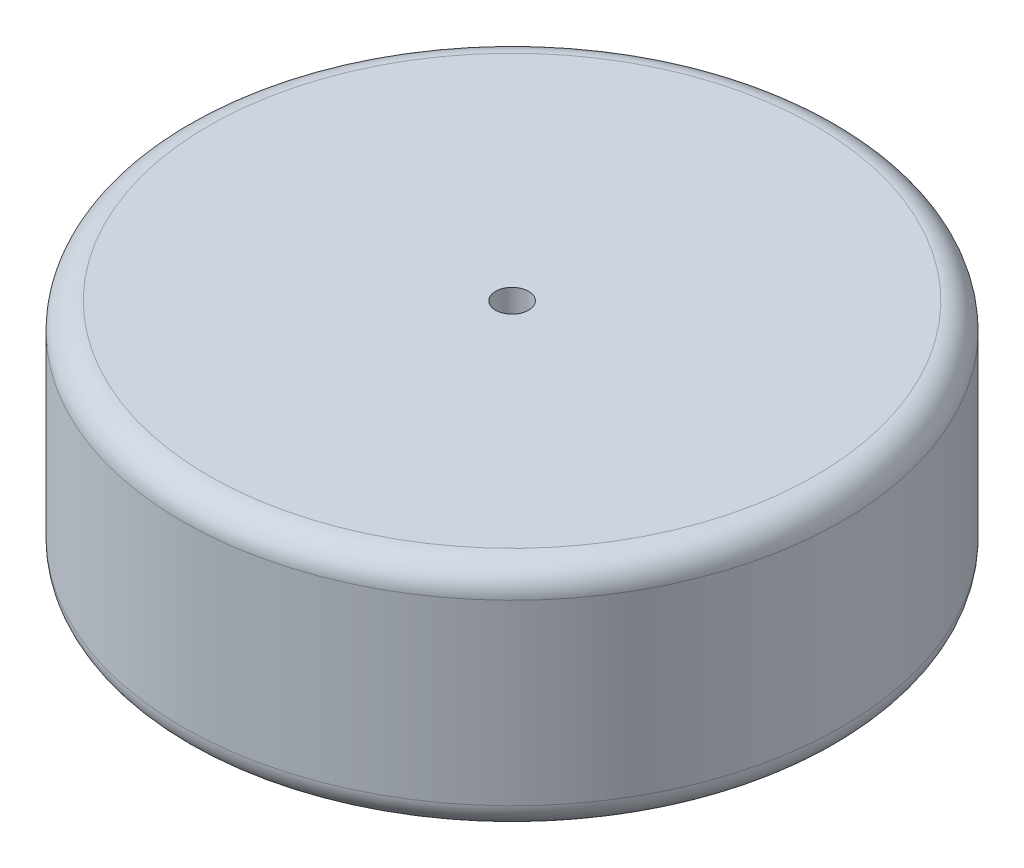
ISO-10303-21;
HEADER;
FILE_DESCRIPTION(('STEP AP214'),'2;1');
FILE_NAME('part.step','',(''),(''),'','','');
FILE_SCHEMA(('AUTOMOTIVE_DESIGN { 1 0 10303 214 1 1 1 1 }'));
ENDSEC;
DATA;
#1=APPLICATION_CONTEXT('core data for automotive mechanical design processes');
#2=APPLICATION_PROTOCOL_DEFINITION('international standard','automotive_design',2000,#1);
#3=PRODUCT_CONTEXT('',#1,'mechanical');
#4=PRODUCT('Part','Part','',(#3));
#5=PRODUCT_RELATED_PRODUCT_CATEGORY('part','',(#4));
#6=PRODUCT_DEFINITION_FORMATION('','',#4);
#7=PRODUCT_DEFINITION_CONTEXT('part definition',#1,'design');
#8=PRODUCT_DEFINITION('design','',#6,#7);
#9=PRODUCT_DEFINITION_SHAPE('','',#8);
#10=(LENGTH_UNIT() NAMED_UNIT(*) SI_UNIT(.MILLI.,.METRE.));
#11=(NAMED_UNIT(*) PLANE_ANGLE_UNIT() SI_UNIT($,.RADIAN.));
#12=(NAMED_UNIT(*) SI_UNIT($,.STERADIAN.) SOLID_ANGLE_UNIT());
#13=UNCERTAINTY_MEASURE_WITH_UNIT(LENGTH_MEASURE(1.E-05),#10,'distance_accuracy_value','');
#14=(GEOMETRIC_REPRESENTATION_CONTEXT(3) GLOBAL_UNCERTAINTY_ASSIGNED_CONTEXT((#13)) GLOBAL_UNIT_ASSIGNED_CONTEXT((#10,
#11,#12)) REPRESENTATION_CONTEXT('',''));
#15=CARTESIAN_POINT('',(0.,0.,0.));
#16=DIRECTION('',(0.,0.,1.));
#17=DIRECTION('',(1.,0.,0.));
#18=AXIS2_PLACEMENT_3D('',#15,#16,#17);
#19=CARTESIAN_POINT('',(0.,70.,0.));
#20=DIRECTION('',(0.,-1.,0.));
#21=DIRECTION('',(0.,0.,-1.));
#22=AXIS2_PLACEMENT_3D('',#19,#20,#21);
#23=CYLINDRICAL_SURFACE('',#22,100.);
#24=CARTESIAN_POINT('',(0.,8.,0.));
#25=DIRECTION('',(0.,1.,0.));
#26=DIRECTION('',(0.,0.,1.));
#27=AXIS2_PLACEMENT_3D('',#24,#25,#26);
#28=CIRCLE('',#27,100.);
#29=CARTESIAN_POINT('',(0.,8.,100.));
#30=VERTEX_POINT('',#29);
#31=EDGE_CURVE('E48',#30,#30,#28,.T.);
#32=ORIENTED_EDGE('',*,*,#31,.T.);
#33=EDGE_LOOP('',(#32));
#34=FACE_BOUND('',#33,.T.);
#35=CARTESIAN_POINT('',(0.,62.,0.));
#36=DIRECTION('',(0.,1.,0.));
#37=DIRECTION('',(0.,0.,1.));
#38=AXIS2_PLACEMENT_3D('',#35,#36,#37);
#39=CIRCLE('',#38,100.);
#40=CARTESIAN_POINT('',(0.,62.,100.));
#41=VERTEX_POINT('',#40);
#42=EDGE_CURVE('E52',#41,#41,#39,.F.);
#43=ORIENTED_EDGE('',*,*,#42,.T.);
#44=EDGE_LOOP('',(#43));
#45=FACE_BOUND('',#44,.T.);
#46=ADVANCED_FACE('F37',(#34,#45),#23,.T.);
#47=CARTESIAN_POINT('',(0.,70.,0.));
#48=DIRECTION('',(0.,1.,0.));
#49=DIRECTION('',(0.,0.,1.));
#50=AXIS2_PLACEMENT_3D('',#47,#48,#49);
#51=PLANE('',#50);
#52=CARTESIAN_POINT('',(0.,70.,0.));
#53=DIRECTION('',(0.,-1.,0.));
#54=DIRECTION('',(0.,0.,-1.));
#55=AXIS2_PLACEMENT_3D('',#52,#53,#54);
#56=CIRCLE('',#55,5.);
#57=CARTESIAN_POINT('',(0.,70.,-5.));
#58=VERTEX_POINT('',#57);
#59=EDGE_CURVE('E57',#58,#58,#56,.T.);
#60=ORIENTED_EDGE('',*,*,#59,.T.);
#61=EDGE_LOOP('',(#60));
#62=FACE_BOUND('',#61,.T.);
#63=CARTESIAN_POINT('',(0.,70.,0.));
#64=DIRECTION('',(0.,1.,0.));
#65=DIRECTION('',(0.,0.,1.));
#66=AXIS2_PLACEMENT_3D('',#63,#64,#65);
#67=CIRCLE('',#66,92.);
#68=CARTESIAN_POINT('',(0.,70.,92.));
#69=VERTEX_POINT('',#68);
#70=EDGE_CURVE('E10',#69,#69,#67,.T.);
#71=ORIENTED_EDGE('',*,*,#70,.T.);
#72=EDGE_LOOP('',(#71));
#73=FACE_BOUND('',#72,.T.);
#74=ADVANCED_FACE('F64',(#62,#73),#51,.T.);
#75=CARTESIAN_POINT('',(0.,0.,0.));
#76=DIRECTION('',(0.,1.,0.));
#77=DIRECTION('',(0.,0.,1.));
#78=AXIS2_PLACEMENT_3D('',#75,#76,#77);
#79=PLANE('',#78);
#80=CARTESIAN_POINT('',(0.,0.,0.));
#81=DIRECTION('',(0.,-1.,0.));
#82=DIRECTION('',(0.,0.,-1.));
#83=AXIS2_PLACEMENT_3D('',#80,#81,#82);
#84=CIRCLE('',#83,5.);
#85=CARTESIAN_POINT('',(0.,0.,-5.));
#86=VERTEX_POINT('',#85);
#87=EDGE_CURVE('E58',#86,#86,#84,.T.);
#88=ORIENTED_EDGE('',*,*,#87,.F.);
#89=EDGE_LOOP('',(#88));
#90=FACE_BOUND('',#89,.T.);
#91=CARTESIAN_POINT('',(0.,0.,0.));
#92=DIRECTION('',(0.,1.,0.));
#93=DIRECTION('',(0.,0.,1.));
#94=AXIS2_PLACEMENT_3D('',#91,#92,#93);
#95=CIRCLE('',#94,92.);
#96=CARTESIAN_POINT('',(0.,0.,92.));
#97=VERTEX_POINT('',#96);
#98=EDGE_CURVE('E44',#97,#97,#95,.F.);
#99=ORIENTED_EDGE('',*,*,#98,.T.);
#100=EDGE_LOOP('',(#99));
#101=FACE_BOUND('',#100,.T.);
#102=ADVANCED_FACE('F72',(#90,#101),#79,.F.);
#103=CARTESIAN_POINT('',(0.,8.,0.));
#104=DIRECTION('',(0.,1.,0.));
#105=DIRECTION('',(0.,0.,1.));
#106=AXIS2_PLACEMENT_3D('',#103,#104,#105);
#107=TOROIDAL_SURFACE('',#106,92.,8.);
#108=ORIENTED_EDGE('',*,*,#98,.F.);
#109=EDGE_LOOP('',(#108));
#110=FACE_BOUND('',#109,.T.);
#111=ORIENTED_EDGE('',*,*,#31,.F.);
#112=EDGE_LOOP('',(#111));
#113=FACE_BOUND('',#112,.T.);
#114=ADVANCED_FACE('F74',(#110,#113),#107,.T.);
#115=CARTESIAN_POINT('',(0.,62.,0.));
#116=DIRECTION('',(0.,1.,0.));
#117=DIRECTION('',(0.,0.,1.));
#118=AXIS2_PLACEMENT_3D('',#115,#116,#117);
#119=TOROIDAL_SURFACE('',#118,92.,8.);
#120=ORIENTED_EDGE('',*,*,#42,.F.);
#121=EDGE_LOOP('',(#120));
#122=FACE_BOUND('',#121,.T.);
#123=ORIENTED_EDGE('',*,*,#70,.F.);
#124=EDGE_LOOP('',(#123));
#125=FACE_BOUND('',#124,.T.);
#126=ADVANCED_FACE('F39',(#122,#125),#119,.T.);
#127=CARTESIAN_POINT('',(0.,70.,0.));
#128=DIRECTION('',(0.,-1.,0.));
#129=DIRECTION('',(0.,0.,-1.));
#130=AXIS2_PLACEMENT_3D('',#127,#128,#129);
#131=CYLINDRICAL_SURFACE('',#130,5.);
#132=ORIENTED_EDGE('',*,*,#59,.F.);
#133=EDGE_LOOP('',(#132));
#134=FACE_BOUND('',#133,.T.);
#135=ORIENTED_EDGE('',*,*,#87,.T.);
#136=EDGE_LOOP('',(#135));
#137=FACE_BOUND('',#136,.T.);
#138=ADVANCED_FACE('F66',(#134,#137),#131,.F.);
#139=CLOSED_SHELL('',(#46,#74,#102,#114,#126,#138));
#140=MANIFOLD_SOLID_BREP('B2',#139);
#141=ADVANCED_BREP_SHAPE_REPRESENTATION('',(#18,#140),#14);
#142=SHAPE_DEFINITION_REPRESENTATION(#9,#141);
ENDSEC;
END-ISO-10303-21;
